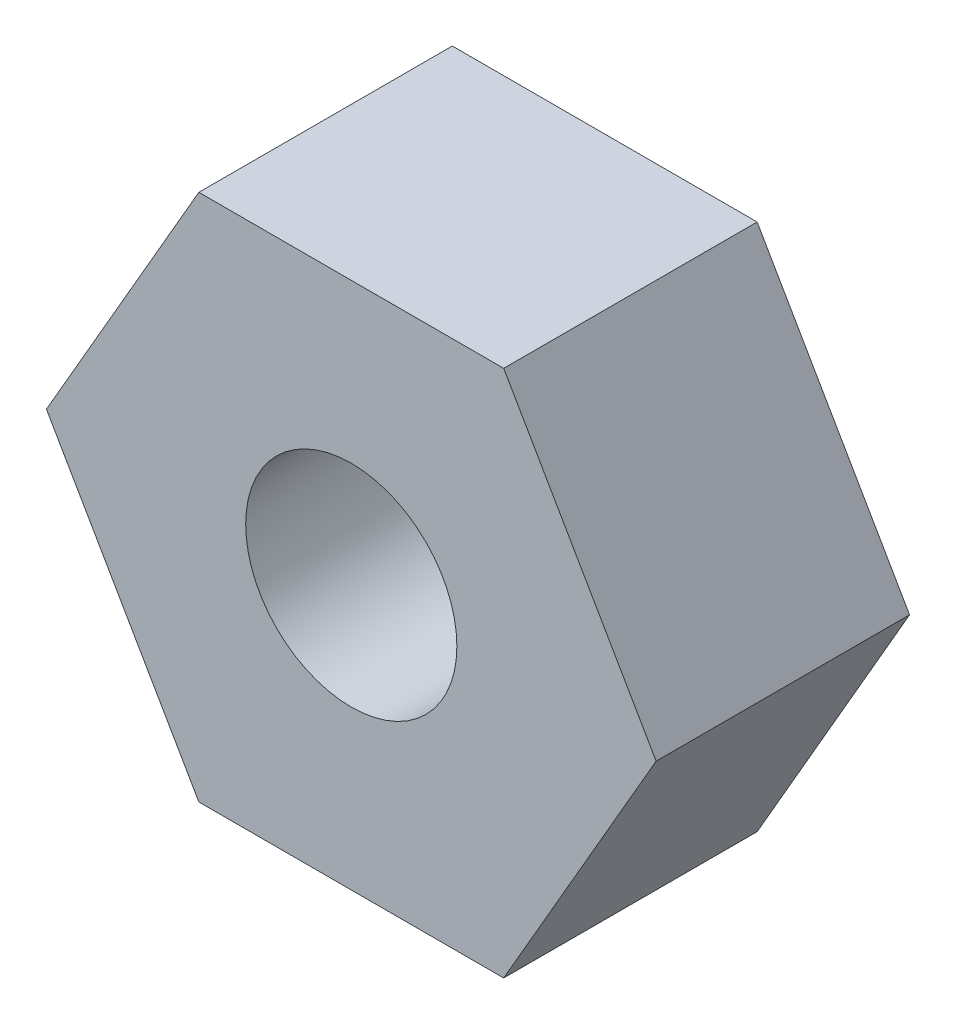
ISO-10303-21;
HEADER;
FILE_DESCRIPTION(('STEP AP214'),'2;1');
FILE_NAME('part.step','',(''),(''),'','','');
FILE_SCHEMA(('AUTOMOTIVE_DESIGN { 1 0 10303 214 1 1 1 1 }'));
ENDSEC;
DATA;
#1=APPLICATION_CONTEXT('core data for automotive mechanical design processes');
#2=APPLICATION_PROTOCOL_DEFINITION('international standard','automotive_design',2000,#1);
#3=PRODUCT_CONTEXT('',#1,'mechanical');
#4=PRODUCT('Part','Part','',(#3));
#5=PRODUCT_RELATED_PRODUCT_CATEGORY('part','',(#4));
#6=PRODUCT_DEFINITION_FORMATION('','',#4);
#7=PRODUCT_DEFINITION_CONTEXT('part definition',#1,'design');
#8=PRODUCT_DEFINITION('design','',#6,#7);
#9=PRODUCT_DEFINITION_SHAPE('','',#8);
#10=(LENGTH_UNIT() NAMED_UNIT(*) SI_UNIT(.MILLI.,.METRE.));
#11=(NAMED_UNIT(*) PLANE_ANGLE_UNIT() SI_UNIT($,.RADIAN.));
#12=(NAMED_UNIT(*) SI_UNIT($,.STERADIAN.) SOLID_ANGLE_UNIT());
#13=UNCERTAINTY_MEASURE_WITH_UNIT(LENGTH_MEASURE(1.E-05),#10,'distance_accuracy_value','');
#14=(GEOMETRIC_REPRESENTATION_CONTEXT(3) GLOBAL_UNCERTAINTY_ASSIGNED_CONTEXT((#13)) GLOBAL_UNIT_ASSIGNED_CONTEXT((#10,
#11,#12)) REPRESENTATION_CONTEXT('',''));
#15=CARTESIAN_POINT('',(0.,0.,0.));
#16=DIRECTION('',(0.,0.,1.));
#17=DIRECTION('',(1.,0.,0.));
#18=AXIS2_PLACEMENT_3D('',#15,#16,#17);
#19=CARTESIAN_POINT('',(0.,0.,4.8));
#20=DIRECTION('',(0.,0.,1.));
#21=DIRECTION('',(1.,0.,0.));
#22=AXIS2_PLACEMENT_3D('',#19,#20,#21);
#23=PLANE('',#22);
#24=DIRECTION('',(1.,0.,0.));
#25=VECTOR('',#24,1.);
#26=CARTESIAN_POINT('',(-2.88675134594813,-5.,4.8));
#27=LINE('',#26,#25);
#28=CARTESIAN_POINT('',(-2.88675134594813,-5.,4.8));
#29=VERTEX_POINT('',#28);
#30=CARTESIAN_POINT('',(2.88675134594813,-5.,4.8));
#31=VERTEX_POINT('',#30);
#32=EDGE_CURVE('E131',#29,#31,#27,.T.);
#33=ORIENTED_EDGE('',*,*,#32,.T.);
#34=DIRECTION('',(0.5,0.866025403784439,0.));
#35=VECTOR('',#34,1.);
#36=CARTESIAN_POINT('',(2.88675134594813,-5.,4.8));
#37=LINE('',#36,#35);
#38=CARTESIAN_POINT('',(5.77350269189626,0.,4.8));
#39=VERTEX_POINT('',#38);
#40=EDGE_CURVE('E89',#31,#39,#37,.T.);
#41=ORIENTED_EDGE('',*,*,#40,.T.);
#42=DIRECTION('',(-0.5,0.866025403784439,0.));
#43=VECTOR('',#42,1.);
#44=CARTESIAN_POINT('',(5.77350269189626,0.,4.8));
#45=LINE('',#44,#43);
#46=CARTESIAN_POINT('',(2.88675134594813,5.,4.8));
#47=VERTEX_POINT('',#46);
#48=EDGE_CURVE('E102',#39,#47,#45,.T.);
#49=ORIENTED_EDGE('',*,*,#48,.T.);
#50=DIRECTION('',(-1.,0.,0.));
#51=VECTOR('',#50,1.);
#52=CARTESIAN_POINT('',(2.88675134594813,5.,4.8));
#53=LINE('',#52,#51);
#54=CARTESIAN_POINT('',(-2.88675134594813,5.,4.8));
#55=VERTEX_POINT('',#54);
#56=EDGE_CURVE('E96',#47,#55,#53,.T.);
#57=ORIENTED_EDGE('',*,*,#56,.T.);
#58=DIRECTION('',(-0.5,-0.866025403784439,0.));
#59=VECTOR('',#58,1.);
#60=CARTESIAN_POINT('',(-2.88675134594813,5.,4.8));
#61=LINE('',#60,#59);
#62=CARTESIAN_POINT('',(-5.77350269189626,0.,4.8));
#63=VERTEX_POINT('',#62);
#64=EDGE_CURVE('E100',#55,#63,#61,.T.);
#65=ORIENTED_EDGE('',*,*,#64,.T.);
#66=DIRECTION('',(0.5,-0.866025403784439,0.));
#67=VECTOR('',#66,1.);
#68=CARTESIAN_POINT('',(-5.77350269189626,0.,4.8));
#69=LINE('',#68,#67);
#70=EDGE_CURVE('E52',#63,#29,#69,.T.);
#71=ORIENTED_EDGE('',*,*,#70,.T.);
#72=EDGE_LOOP('',(#33,#41,#49,#57,#65,#71));
#73=FACE_BOUND('',#72,.T.);
#74=CARTESIAN_POINT('',(0.,0.,4.8));
#75=DIRECTION('',(0.,0.,1.));
#76=DIRECTION('',(1.,0.,0.));
#77=AXIS2_PLACEMENT_3D('',#74,#75,#76);
#78=CIRCLE('',#77,2.);
#79=CARTESIAN_POINT('',(2.,0.,4.8));
#80=VERTEX_POINT('',#79);
#81=EDGE_CURVE('E124',#80,#80,#78,.T.);
#82=ORIENTED_EDGE('',*,*,#81,.F.);
#83=EDGE_LOOP('',(#82));
#84=FACE_BOUND('',#83,.T.);
#85=ADVANCED_FACE('F35',(#73,#84),#23,.T.);
#86=CARTESIAN_POINT('',(0.,0.,0.));
#87=DIRECTION('',(0.,0.,1.));
#88=DIRECTION('',(1.,0.,0.));
#89=AXIS2_PLACEMENT_3D('',#86,#87,#88);
#90=PLANE('',#89);
#91=DIRECTION('',(1.,0.,0.));
#92=VECTOR('',#91,1.);
#93=CARTESIAN_POINT('',(-2.88675134594813,-5.,0.));
#94=LINE('',#93,#92);
#95=CARTESIAN_POINT('',(-2.88675134594813,-5.,0.));
#96=VERTEX_POINT('',#95);
#97=CARTESIAN_POINT('',(2.88675134594813,-5.,0.));
#98=VERTEX_POINT('',#97);
#99=EDGE_CURVE('E120',#96,#98,#94,.T.);
#100=ORIENTED_EDGE('',*,*,#99,.F.);
#101=DIRECTION('',(0.5,-0.866025403784439,0.));
#102=VECTOR('',#101,1.);
#103=CARTESIAN_POINT('',(-5.77350269189626,0.,0.));
#104=LINE('',#103,#102);
#105=CARTESIAN_POINT('',(-5.77350269189626,0.,0.));
#106=VERTEX_POINT('',#105);
#107=EDGE_CURVE('E81',#106,#96,#104,.T.);
#108=ORIENTED_EDGE('',*,*,#107,.F.);
#109=DIRECTION('',(-0.5,-0.866025403784439,0.));
#110=VECTOR('',#109,1.);
#111=CARTESIAN_POINT('',(-2.88675134594813,5.,0.));
#112=LINE('',#111,#110);
#113=CARTESIAN_POINT('',(-2.88675134594813,5.,0.));
#114=VERTEX_POINT('',#113);
#115=EDGE_CURVE('E75',#114,#106,#112,.T.);
#116=ORIENTED_EDGE('',*,*,#115,.F.);
#117=DIRECTION('',(-1.,0.,0.));
#118=VECTOR('',#117,1.);
#119=CARTESIAN_POINT('',(2.88675134594813,5.,0.));
#120=LINE('',#119,#118);
#121=CARTESIAN_POINT('',(2.88675134594813,5.,0.));
#122=VERTEX_POINT('',#121);
#123=EDGE_CURVE('E110',#122,#114,#120,.T.);
#124=ORIENTED_EDGE('',*,*,#123,.F.);
#125=DIRECTION('',(-0.5,0.866025403784439,0.));
#126=VECTOR('',#125,1.);
#127=CARTESIAN_POINT('',(5.77350269189626,0.,0.));
#128=LINE('',#127,#126);
#129=CARTESIAN_POINT('',(5.77350269189626,0.,0.));
#130=VERTEX_POINT('',#129);
#131=EDGE_CURVE('E126',#130,#122,#128,.T.);
#132=ORIENTED_EDGE('',*,*,#131,.F.);
#133=DIRECTION('',(0.5,0.866025403784439,0.));
#134=VECTOR('',#133,1.);
#135=CARTESIAN_POINT('',(2.88675134594813,-5.,0.));
#136=LINE('',#135,#134);
#137=EDGE_CURVE('E123',#98,#130,#136,.T.);
#138=ORIENTED_EDGE('',*,*,#137,.F.);
#139=EDGE_LOOP('',(#100,#108,#116,#124,#132,#138));
#140=FACE_BOUND('',#139,.T.);
#141=CARTESIAN_POINT('',(0.,0.,0.));
#142=DIRECTION('',(0.,0.,1.));
#143=DIRECTION('',(1.,0.,0.));
#144=AXIS2_PLACEMENT_3D('',#141,#142,#143);
#145=CIRCLE('',#144,2.);
#146=CARTESIAN_POINT('',(2.,0.,0.));
#147=VERTEX_POINT('',#146);
#148=EDGE_CURVE('E224',#147,#147,#145,.T.);
#149=ORIENTED_EDGE('',*,*,#148,.T.);
#150=EDGE_LOOP('',(#149));
#151=FACE_BOUND('',#150,.T.);
#152=ADVANCED_FACE('F140',(#140,#151),#90,.F.);
#153=CARTESIAN_POINT('',(-2.88675134594813,-5.,4.8));
#154=DIRECTION('',(0.,1.,0.));
#155=DIRECTION('',(0.,0.,1.));
#156=AXIS2_PLACEMENT_3D('',#153,#154,#155);
#157=PLANE('',#156);
#158=ORIENTED_EDGE('',*,*,#99,.T.);
#159=DIRECTION('',(0.,0.,-1.));
#160=VECTOR('',#159,1.);
#161=CARTESIAN_POINT('',(2.88675134594813,-5.,4.8));
#162=LINE('',#161,#160);
#163=EDGE_CURVE('E11',#31,#98,#162,.T.);
#164=ORIENTED_EDGE('',*,*,#163,.F.);
#165=ORIENTED_EDGE('',*,*,#32,.F.);
#166=DIRECTION('',(0.,0.,-1.));
#167=VECTOR('',#166,1.);
#168=CARTESIAN_POINT('',(-2.88675134594813,-5.,4.8));
#169=LINE('',#168,#167);
#170=EDGE_CURVE('E116',#29,#96,#169,.T.);
#171=ORIENTED_EDGE('',*,*,#170,.T.);
#172=EDGE_LOOP('',(#158,#164,#165,#171));
#173=FACE_BOUND('',#172,.T.);
#174=ADVANCED_FACE('F37',(#173),#157,.F.);
#175=CARTESIAN_POINT('',(2.88675134594813,-5.,4.8));
#176=DIRECTION('',(-0.866025403784439,0.5,0.));
#177=DIRECTION('',(-0.5,-0.866025403784439,0.));
#178=AXIS2_PLACEMENT_3D('',#175,#176,#177);
#179=PLANE('',#178);
#180=ORIENTED_EDGE('',*,*,#137,.T.);
#181=DIRECTION('',(0.,0.,-1.));
#182=VECTOR('',#181,1.);
#183=CARTESIAN_POINT('',(5.77350269189626,0.,4.8));
#184=LINE('',#183,#182);
#185=EDGE_CURVE('E44',#39,#130,#184,.T.);
#186=ORIENTED_EDGE('',*,*,#185,.F.);
#187=ORIENTED_EDGE('',*,*,#40,.F.);
#188=ORIENTED_EDGE('',*,*,#163,.T.);
#189=EDGE_LOOP('',(#180,#186,#187,#188));
#190=FACE_BOUND('',#189,.T.);
#191=ADVANCED_FACE('F165',(#190),#179,.F.);
#192=CARTESIAN_POINT('',(5.77350269189626,0.,4.8));
#193=DIRECTION('',(-0.866025403784439,-0.5,0.));
#194=DIRECTION('',(0.5,-0.866025403784439,0.));
#195=AXIS2_PLACEMENT_3D('',#192,#193,#194);
#196=PLANE('',#195);
#197=ORIENTED_EDGE('',*,*,#131,.T.);
#198=DIRECTION('',(0.,0.,-1.));
#199=VECTOR('',#198,1.);
#200=CARTESIAN_POINT('',(2.88675134594813,5.,4.8));
#201=LINE('',#200,#199);
#202=EDGE_CURVE('E111',#47,#122,#201,.T.);
#203=ORIENTED_EDGE('',*,*,#202,.F.);
#204=ORIENTED_EDGE('',*,*,#48,.F.);
#205=ORIENTED_EDGE('',*,*,#185,.T.);
#206=EDGE_LOOP('',(#197,#203,#204,#205));
#207=FACE_BOUND('',#206,.T.);
#208=ADVANCED_FACE('F137',(#207),#196,.F.);
#209=CARTESIAN_POINT('',(2.88675134594813,5.,4.8));
#210=DIRECTION('',(0.,-1.,0.));
#211=DIRECTION('',(0.,0.,-1.));
#212=AXIS2_PLACEMENT_3D('',#209,#210,#211);
#213=PLANE('',#212);
#214=ORIENTED_EDGE('',*,*,#123,.T.);
#215=DIRECTION('',(0.,0.,-1.));
#216=VECTOR('',#215,1.);
#217=CARTESIAN_POINT('',(-2.88675134594813,5.,4.8));
#218=LINE('',#217,#216);
#219=EDGE_CURVE('E107',#55,#114,#218,.T.);
#220=ORIENTED_EDGE('',*,*,#219,.F.);
#221=ORIENTED_EDGE('',*,*,#56,.F.);
#222=ORIENTED_EDGE('',*,*,#202,.T.);
#223=EDGE_LOOP('',(#214,#220,#221,#222));
#224=FACE_BOUND('',#223,.T.);
#225=ADVANCED_FACE('F108',(#224),#213,.F.);
#226=CARTESIAN_POINT('',(-2.88675134594813,5.,4.8));
#227=DIRECTION('',(0.866025403784439,-0.5,0.));
#228=DIRECTION('',(0.5,0.866025403784439,0.));
#229=AXIS2_PLACEMENT_3D('',#226,#227,#228);
#230=PLANE('',#229);
#231=ORIENTED_EDGE('',*,*,#115,.T.);
#232=DIRECTION('',(0.,0.,-1.));
#233=VECTOR('',#232,1.);
#234=CARTESIAN_POINT('',(-5.77350269189626,0.,4.8));
#235=LINE('',#234,#233);
#236=EDGE_CURVE('E112',#63,#106,#235,.T.);
#237=ORIENTED_EDGE('',*,*,#236,.F.);
#238=ORIENTED_EDGE('',*,*,#64,.F.);
#239=ORIENTED_EDGE('',*,*,#219,.T.);
#240=EDGE_LOOP('',(#231,#237,#238,#239));
#241=FACE_BOUND('',#240,.T.);
#242=ADVANCED_FACE('F114',(#241),#230,.F.);
#243=CARTESIAN_POINT('',(-5.77350269189626,0.,4.8));
#244=DIRECTION('',(0.866025403784439,0.5,0.));
#245=DIRECTION('',(-0.5,0.866025403784439,0.));
#246=AXIS2_PLACEMENT_3D('',#243,#244,#245);
#247=PLANE('',#246);
#248=ORIENTED_EDGE('',*,*,#107,.T.);
#249=ORIENTED_EDGE('',*,*,#170,.F.);
#250=ORIENTED_EDGE('',*,*,#70,.F.);
#251=ORIENTED_EDGE('',*,*,#236,.T.);
#252=EDGE_LOOP('',(#248,#249,#250,#251));
#253=FACE_BOUND('',#252,.T.);
#254=ADVANCED_FACE('F145',(#253),#247,.F.);
#255=CARTESIAN_POINT('',(0.,0.,4.8));
#256=DIRECTION('',(0.,0.,-1.));
#257=DIRECTION('',(-1.,0.,0.));
#258=AXIS2_PLACEMENT_3D('',#255,#256,#257);
#259=CYLINDRICAL_SURFACE('',#258,2.);
#260=ORIENTED_EDGE('',*,*,#81,.T.);
#261=EDGE_LOOP('',(#260));
#262=FACE_BOUND('',#261,.T.);
#263=ORIENTED_EDGE('',*,*,#148,.F.);
#264=EDGE_LOOP('',(#263));
#265=FACE_BOUND('',#264,.T.);
#266=ADVANCED_FACE('F147',(#262,#265),#259,.F.);
#267=CLOSED_SHELL('',(#85,#152,#174,#191,#208,#225,#242,#254,#266));
#268=MANIFOLD_SOLID_BREP('B2',#267);
#269=ADVANCED_BREP_SHAPE_REPRESENTATION('',(#18,#268),#14);
#270=SHAPE_DEFINITION_REPRESENTATION(#9,#269);
ENDSEC;
END-ISO-10303-21;
